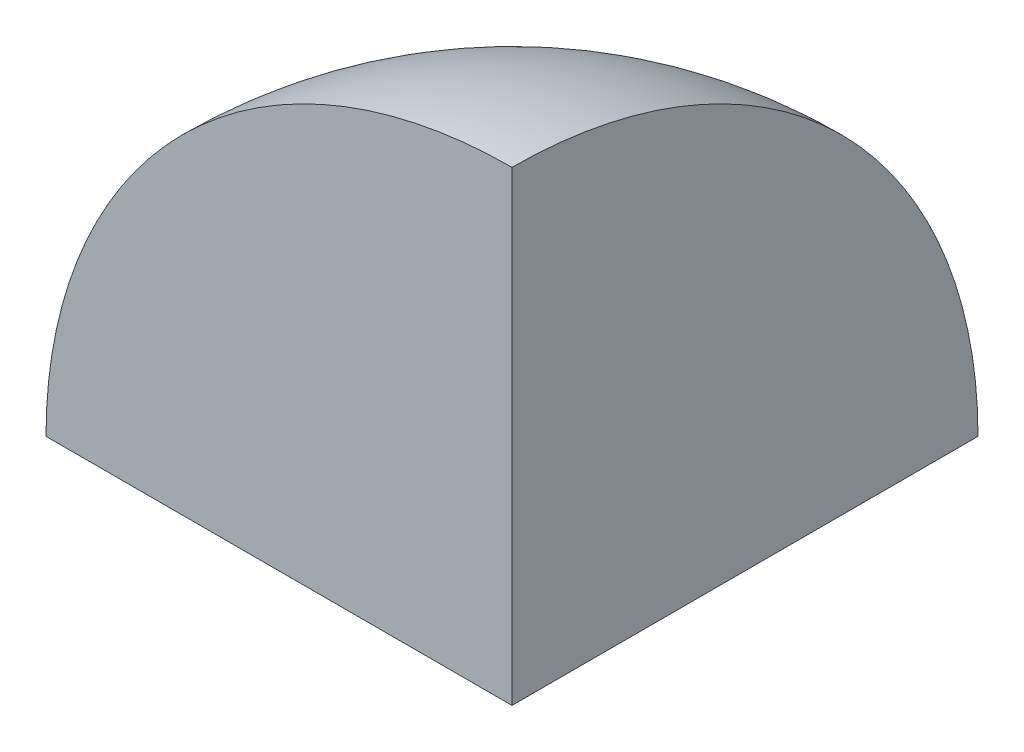
ISO-10303-21;
HEADER;
FILE_DESCRIPTION(('STEP AP214'),'2;1');
FILE_NAME('part.step','',(''),(''),'','','');
FILE_SCHEMA(('AUTOMOTIVE_DESIGN { 1 0 10303 214 1 1 1 1 }'));
ENDSEC;
DATA;
#1=APPLICATION_CONTEXT('core data for automotive mechanical design processes');
#2=APPLICATION_PROTOCOL_DEFINITION('international standard','automotive_design',2000,#1);
#3=PRODUCT_CONTEXT('',#1,'mechanical');
#4=PRODUCT('Part','Part','',(#3));
#5=PRODUCT_RELATED_PRODUCT_CATEGORY('part','',(#4));
#6=PRODUCT_DEFINITION_FORMATION('','',#4);
#7=PRODUCT_DEFINITION_CONTEXT('part definition',#1,'design');
#8=PRODUCT_DEFINITION('design','',#6,#7);
#9=PRODUCT_DEFINITION_SHAPE('','',#8);
#10=(LENGTH_UNIT() NAMED_UNIT(*) SI_UNIT(.MILLI.,.METRE.));
#11=(NAMED_UNIT(*) PLANE_ANGLE_UNIT() SI_UNIT($,.RADIAN.));
#12=(NAMED_UNIT(*) SI_UNIT($,.STERADIAN.) SOLID_ANGLE_UNIT());
#13=UNCERTAINTY_MEASURE_WITH_UNIT(LENGTH_MEASURE(1.E-05),#10,'distance_accuracy_value','');
#14=(GEOMETRIC_REPRESENTATION_CONTEXT(3) GLOBAL_UNCERTAINTY_ASSIGNED_CONTEXT((#13)) GLOBAL_UNIT_ASSIGNED_CONTEXT((#10,
#11,#12)) REPRESENTATION_CONTEXT('',''));
#15=CARTESIAN_POINT('',(0.,0.,0.));
#16=DIRECTION('',(0.,0.,1.));
#17=DIRECTION('',(1.,0.,0.));
#18=AXIS2_PLACEMENT_3D('',#15,#16,#17);
#19=CARTESIAN_POINT('',(0.,0.,-13.435));
#20=DIRECTION('',(0.,0.,1.));
#21=DIRECTION('',(1.,0.,0.));
#22=AXIS2_PLACEMENT_3D('',#19,#20,#21);
#23=PLANE('',#22);
#24=DIRECTION('',(0.,-1.,0.));
#25=VECTOR('',#24,1.);
#26=CARTESIAN_POINT('',(-13.435,0.,-13.435));
#27=LINE('',#26,#25);
#28=CARTESIAN_POINT('',(-13.435,50.8699999999827,-13.435));
#29=VERTEX_POINT('',#28);
#30=CARTESIAN_POINT('',(-13.435,26.87,-13.435));
#31=VERTEX_POINT('',#30);
#32=EDGE_CURVE('E67',#29,#31,#27,.T.);
#33=ORIENTED_EDGE('',*,*,#32,.F.);
#34=CARTESIAN_POINT('',(-13.435,26.87,-13.435));
#35=DIRECTION('',(0.,0.,1.));
#36=DIRECTION('',(1.,0.,0.));
#37=AXIS2_PLACEMENT_3D('',#34,#35,#36);
#38=CIRCLE('',#37,23.9999999999827);
#39=CARTESIAN_POINT('',(-37.4349999999827,26.87,-13.435));
#40=VERTEX_POINT('',#39);
#41=EDGE_CURVE('E51',#29,#40,#38,.T.);
#42=ORIENTED_EDGE('',*,*,#41,.T.);
#43=DIRECTION('',(1.,0.,0.));
#44=VECTOR('',#43,1.);
#45=CARTESIAN_POINT('',(0.,26.87,-13.435));
#46=LINE('',#45,#44);
#47=EDGE_CURVE('E12',#40,#31,#46,.T.);
#48=ORIENTED_EDGE('',*,*,#47,.T.);
#49=EDGE_LOOP('',(#33,#42,#48));
#50=FACE_BOUND('',#49,.T.);
#51=ADVANCED_FACE('F36',(#50),#23,.T.);
#52=CARTESIAN_POINT('',(-13.435,0.,0.));
#53=DIRECTION('',(1.,0.,0.));
#54=DIRECTION('',(0.,0.,-1.));
#55=AXIS2_PLACEMENT_3D('',#52,#53,#54);
#56=PLANE('',#55);
#57=CARTESIAN_POINT('',(-13.435,26.87,-13.4350288425444));
#58=DIRECTION('',(1.,0.,0.));
#59=DIRECTION('',(0.,0.,-1.));
#60=AXIS2_PLACEMENT_3D('',#57,#58,#59);
#61=CIRCLE('',#60,24.);
#62=CARTESIAN_POINT('',(-13.435,26.87,-37.4350288425444));
#63=VERTEX_POINT('',#62);
#64=EDGE_CURVE('E69',#63,#29,#61,.T.);
#65=ORIENTED_EDGE('',*,*,#64,.T.);
#66=ORIENTED_EDGE('',*,*,#32,.T.);
#67=DIRECTION('',(0.,0.,-1.));
#68=VECTOR('',#67,1.);
#69=CARTESIAN_POINT('',(-13.435,26.87,0.));
#70=LINE('',#69,#68);
#71=EDGE_CURVE('E44',#31,#63,#70,.T.);
#72=ORIENTED_EDGE('',*,*,#71,.T.);
#73=EDGE_LOOP('',(#65,#66,#72));
#74=FACE_BOUND('',#73,.T.);
#75=ADVANCED_FACE('F68',(#74),#56,.T.);
#76=CARTESIAN_POINT('',(-13.435,26.87,-13.4350288425444));
#77=DIRECTION('',(0.,0.,1.));
#78=DIRECTION('',(0.,1.,0.));
#79=AXIS2_PLACEMENT_3D('',#76,#77,#78);
#80=SPHERICAL_SURFACE('',#79,24.);
#81=ORIENTED_EDGE('',*,*,#41,.F.);
#82=ORIENTED_EDGE('',*,*,#64,.F.);
#83=CARTESIAN_POINT('',(-13.435,26.87,-13.4350288425444));
#84=DIRECTION('',(0.,1.,0.));
#85=DIRECTION('',(0.,0.,1.));
#86=AXIS2_PLACEMENT_3D('',#83,#84,#85);
#87=CIRCLE('',#86,24.);
#88=EDGE_CURVE('E64',#63,#40,#87,.T.);
#89=ORIENTED_EDGE('',*,*,#88,.T.);
#90=EDGE_LOOP('',(#81,#82,#89));
#91=FACE_BOUND('',#90,.T.);
#92=ADVANCED_FACE('F38',(#91),#80,.T.);
#93=CARTESIAN_POINT('',(0.,26.87,0.));
#94=DIRECTION('',(0.,1.,0.));
#95=DIRECTION('',(0.,0.,1.));
#96=AXIS2_PLACEMENT_3D('',#93,#94,#95);
#97=PLANE('',#96);
#98=ORIENTED_EDGE('',*,*,#47,.F.);
#99=ORIENTED_EDGE('',*,*,#88,.F.);
#100=ORIENTED_EDGE('',*,*,#71,.F.);
#101=EDGE_LOOP('',(#98,#99,#100));
#102=FACE_BOUND('',#101,.T.);
#103=ADVANCED_FACE('F63',(#102),#97,.F.);
#104=CLOSED_SHELL('',(#51,#75,#92,#103));
#105=MANIFOLD_SOLID_BREP('B2',#104);
#106=ADVANCED_BREP_SHAPE_REPRESENTATION('',(#18,#105),#14);
#107=SHAPE_DEFINITION_REPRESENTATION(#9,#106);
ENDSEC;
END-ISO-10303-21;
